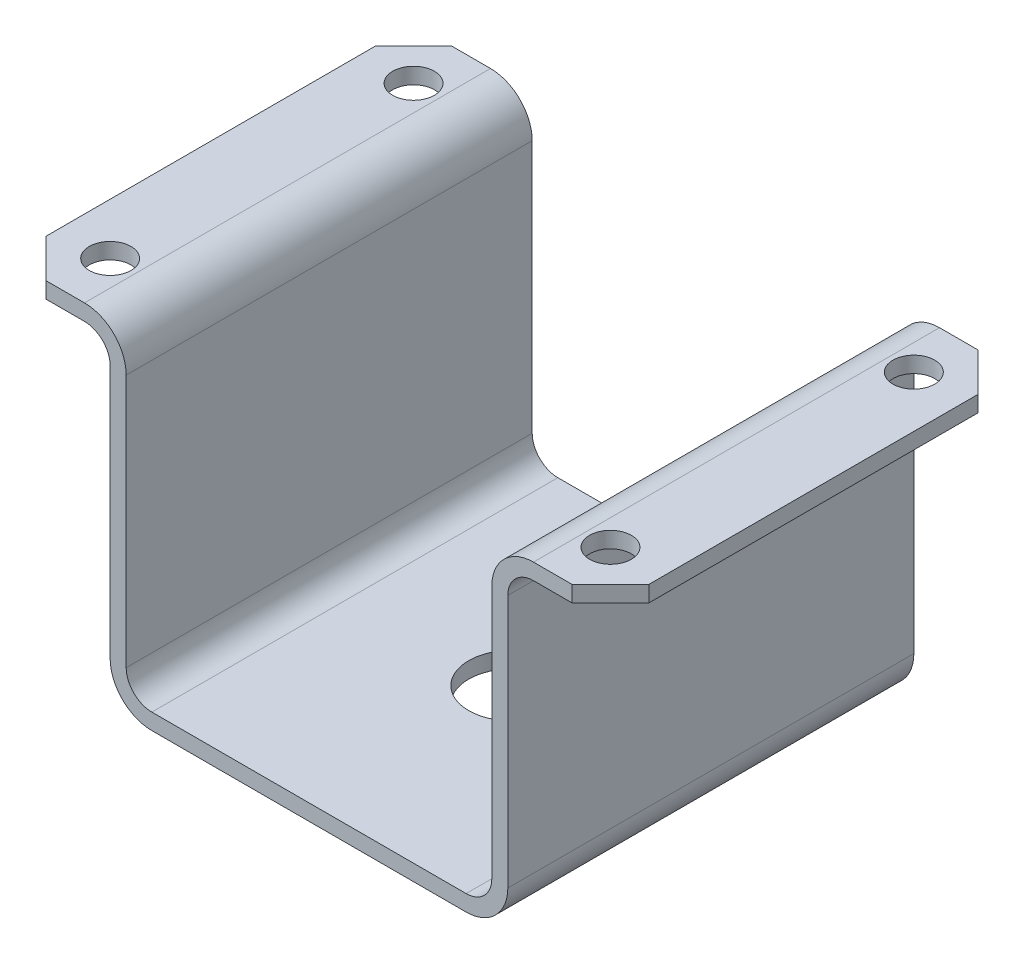
ISO-10303-21;
HEADER;
FILE_DESCRIPTION(('STEP AP214'),'2;1');
FILE_NAME('part.step','',(''),(''),'','','');
FILE_SCHEMA(('AUTOMOTIVE_DESIGN { 1 0 10303 214 1 1 1 1 }'));
ENDSEC;
DATA;
#1=APPLICATION_CONTEXT('core data for automotive mechanical design processes');
#2=APPLICATION_PROTOCOL_DEFINITION('international standard','automotive_design',2000,#1);
#3=PRODUCT_CONTEXT('',#1,'mechanical');
#4=PRODUCT('Part','Part','',(#3));
#5=PRODUCT_RELATED_PRODUCT_CATEGORY('part','',(#4));
#6=PRODUCT_DEFINITION_FORMATION('','',#4);
#7=PRODUCT_DEFINITION_CONTEXT('part definition',#1,'design');
#8=PRODUCT_DEFINITION('design','',#6,#7);
#9=PRODUCT_DEFINITION_SHAPE('','',#8);
#10=(LENGTH_UNIT() NAMED_UNIT(*) SI_UNIT(.MILLI.,.METRE.));
#11=(NAMED_UNIT(*) PLANE_ANGLE_UNIT() SI_UNIT($,.RADIAN.));
#12=(NAMED_UNIT(*) SI_UNIT($,.STERADIAN.) SOLID_ANGLE_UNIT());
#13=UNCERTAINTY_MEASURE_WITH_UNIT(LENGTH_MEASURE(1.E-05),#10,'distance_accuracy_value','');
#14=(GEOMETRIC_REPRESENTATION_CONTEXT(3) GLOBAL_UNCERTAINTY_ASSIGNED_CONTEXT((#13)) GLOBAL_UNIT_ASSIGNED_CONTEXT((#10,
#11,#12)) REPRESENTATION_CONTEXT('',''));
#15=CARTESIAN_POINT('',(0.,0.,0.));
#16=DIRECTION('',(0.,0.,1.));
#17=DIRECTION('',(1.,0.,0.));
#18=AXIS2_PLACEMENT_3D('',#15,#16,#17);
#19=CARTESIAN_POINT('',(-47.,50.,-31.65));
#20=DIRECTION('',(-1.,0.,0.));
#21=DIRECTION('',(0.,0.,1.));
#22=AXIS2_PLACEMENT_3D('',#19,#20,#21);
#23=PLANE('',#22);
#24=DIRECTION('',(0.,1.,0.));
#25=VECTOR('',#24,1.);
#26=CARTESIAN_POINT('',(-47.,36.554648241206,25.65));
#27=LINE('',#26,#25);
#28=CARTESIAN_POINT('',(-47.,52.5,25.65));
#29=VERTEX_POINT('',#28);
#30=CARTESIAN_POINT('',(-47.,50.,25.65));
#31=VERTEX_POINT('',#30);
#32=EDGE_CURVE('E302',#29,#31,#27,.F.);
#33=ORIENTED_EDGE('',*,*,#32,.F.);
#34=DIRECTION('',(0.,0.,1.));
#35=VECTOR('',#34,1.);
#36=CARTESIAN_POINT('',(-47.,52.5,-31.65));
#37=LINE('',#36,#35);
#38=CARTESIAN_POINT('',(-47.,52.5,-25.65));
#39=VERTEX_POINT('',#38);
#40=EDGE_CURVE('E313',#39,#29,#37,.T.);
#41=ORIENTED_EDGE('',*,*,#40,.F.);
#42=DIRECTION('',(0.,1.,0.));
#43=VECTOR('',#42,1.);
#44=CARTESIAN_POINT('',(-47.,36.554648241206,-25.65));
#45=LINE('',#44,#43);
#46=CARTESIAN_POINT('',(-47.,50.,-25.65));
#47=VERTEX_POINT('',#46);
#48=EDGE_CURVE('E167',#47,#39,#45,.T.);
#49=ORIENTED_EDGE('',*,*,#48,.F.);
#50=DIRECTION('',(0.,0.,-1.));
#51=VECTOR('',#50,1.);
#52=CARTESIAN_POINT('',(-47.,50.,-31.65));
#53=LINE('',#52,#51);
#54=EDGE_CURVE('E273',#31,#47,#53,.T.);
#55=ORIENTED_EDGE('',*,*,#54,.F.);
#56=EDGE_LOOP('',(#33,#41,#49,#55));
#57=FACE_BOUND('',#56,.T.);
#58=ADVANCED_FACE('F17',(#57),#23,.T.);
#59=CARTESIAN_POINT('',(-39.,52.5,-23.65));
#60=DIRECTION('',(0.,-1.,0.));
#61=DIRECTION('',(0.,0.,-1.));
#62=AXIS2_PLACEMENT_3D('',#59,#60,#61);
#63=CYLINDRICAL_SURFACE('',#62,3.25000000000001);
#64=CARTESIAN_POINT('',(-39.,50.,-23.65));
#65=DIRECTION('',(0.,-1.,0.));
#66=DIRECTION('',(0.,0.,-1.));
#67=AXIS2_PLACEMENT_3D('',#64,#65,#66);
#68=CIRCLE('',#67,3.25000000000001);
#69=CARTESIAN_POINT('',(-39.,50.,-26.9));
#70=VERTEX_POINT('',#69);
#71=EDGE_CURVE('E270',#70,#70,#68,.F.);
#72=ORIENTED_EDGE('',*,*,#71,.F.);
#73=EDGE_LOOP('',(#72));
#74=FACE_BOUND('',#73,.T.);
#75=CARTESIAN_POINT('',(-39.,52.5,-23.65));
#76=DIRECTION('',(0.,-1.,0.));
#77=DIRECTION('',(0.,0.,-1.));
#78=AXIS2_PLACEMENT_3D('',#75,#76,#77);
#79=CIRCLE('',#78,3.25000000000001);
#80=CARTESIAN_POINT('',(-39.,52.5,-26.9));
#81=VERTEX_POINT('',#80);
#82=EDGE_CURVE('E278',#81,#81,#79,.T.);
#83=ORIENTED_EDGE('',*,*,#82,.F.);
#84=EDGE_LOOP('',(#83));
#85=FACE_BOUND('',#84,.T.);
#86=ADVANCED_FACE('F460',(#74,#85),#63,.F.);
#87=CARTESIAN_POINT('',(-39.,52.5,23.65));
#88=DIRECTION('',(0.,-1.,0.));
#89=DIRECTION('',(0.,0.,-1.));
#90=AXIS2_PLACEMENT_3D('',#87,#88,#89);
#91=CYLINDRICAL_SURFACE('',#90,3.25);
#92=CARTESIAN_POINT('',(-39.,50.,23.65));
#93=DIRECTION('',(0.,-1.,0.));
#94=DIRECTION('',(0.,0.,-1.));
#95=AXIS2_PLACEMENT_3D('',#92,#93,#94);
#96=CIRCLE('',#95,3.25);
#97=CARTESIAN_POINT('',(-39.,50.,20.4));
#98=VERTEX_POINT('',#97);
#99=EDGE_CURVE('E266',#98,#98,#96,.F.);
#100=ORIENTED_EDGE('',*,*,#99,.F.);
#101=EDGE_LOOP('',(#100));
#102=FACE_BOUND('',#101,.T.);
#103=CARTESIAN_POINT('',(-39.,52.5,23.65));
#104=DIRECTION('',(0.,-1.,0.));
#105=DIRECTION('',(0.,0.,-1.));
#106=AXIS2_PLACEMENT_3D('',#103,#104,#105);
#107=CIRCLE('',#106,3.25);
#108=CARTESIAN_POINT('',(-39.,52.5,20.4));
#109=VERTEX_POINT('',#108);
#110=EDGE_CURVE('E274',#109,#109,#107,.T.);
#111=ORIENTED_EDGE('',*,*,#110,.F.);
#112=EDGE_LOOP('',(#111));
#113=FACE_BOUND('',#112,.T.);
#114=ADVANCED_FACE('F466',(#102,#113),#91,.F.);
#115=CARTESIAN_POINT('',(47.,52.5,-25.65));
#116=DIRECTION('',(1.,0.,0.));
#117=DIRECTION('',(0.,0.,1.));
#118=AXIS2_PLACEMENT_3D('',#115,#116,#117);
#119=PLANE('',#118);
#120=DIRECTION('',(0.,1.,0.));
#121=VECTOR('',#120,1.);
#122=CARTESIAN_POINT('',(47.,36.554648241206,25.65));
#123=LINE('',#122,#121);
#124=CARTESIAN_POINT('',(47.,50.,25.65));
#125=VERTEX_POINT('',#124);
#126=CARTESIAN_POINT('',(47.,52.5,25.65));
#127=VERTEX_POINT('',#126);
#128=EDGE_CURVE('E166',#125,#127,#123,.T.);
#129=ORIENTED_EDGE('',*,*,#128,.F.);
#130=DIRECTION('',(0.,0.,1.));
#131=VECTOR('',#130,1.);
#132=CARTESIAN_POINT('',(47.,50.,0.));
#133=LINE('',#132,#131);
#134=CARTESIAN_POINT('',(47.,50.,-25.65));
#135=VERTEX_POINT('',#134);
#136=EDGE_CURVE('E163',#135,#125,#133,.T.);
#137=ORIENTED_EDGE('',*,*,#136,.F.);
#138=DIRECTION('',(0.,1.,0.));
#139=VECTOR('',#138,1.);
#140=CARTESIAN_POINT('',(47.,36.554648241206,-25.65));
#141=LINE('',#140,#139);
#142=CARTESIAN_POINT('',(47.,52.5,-25.65));
#143=VERTEX_POINT('',#142);
#144=EDGE_CURVE('E156',#143,#135,#141,.F.);
#145=ORIENTED_EDGE('',*,*,#144,.F.);
#146=DIRECTION('',(0.,0.,-1.));
#147=VECTOR('',#146,1.);
#148=CARTESIAN_POINT('',(47.,52.5,0.));
#149=LINE('',#148,#147);
#150=EDGE_CURVE('E160',#127,#143,#149,.T.);
#151=ORIENTED_EDGE('',*,*,#150,.F.);
#152=EDGE_LOOP('',(#129,#137,#145,#151));
#153=FACE_BOUND('',#152,.T.);
#154=ADVANCED_FACE('F158',(#153),#119,.T.);
#155=CARTESIAN_POINT('',(39.,51.25,-23.65));
#156=DIRECTION('',(0.,-1.,0.));
#157=DIRECTION('',(1.,0.,0.));
#158=AXIS2_PLACEMENT_3D('',#155,#156,#157);
#159=CYLINDRICAL_SURFACE('',#158,3.25);
#160=CARTESIAN_POINT('',(39.,50.,-23.65));
#161=DIRECTION('',(0.,-1.,0.));
#162=DIRECTION('',(1.,0.,0.));
#163=AXIS2_PLACEMENT_3D('',#160,#161,#162);
#164=CIRCLE('',#163,3.25);
#165=CARTESIAN_POINT('',(42.25,50.,-23.65));
#166=VERTEX_POINT('',#165);
#167=EDGE_CURVE('E256',#166,#166,#164,.F.);
#168=ORIENTED_EDGE('',*,*,#167,.F.);
#169=EDGE_LOOP('',(#168));
#170=FACE_BOUND('',#169,.T.);
#171=CARTESIAN_POINT('',(39.,52.5,-23.65));
#172=DIRECTION('',(0.,-1.,0.));
#173=DIRECTION('',(1.,0.,0.));
#174=AXIS2_PLACEMENT_3D('',#171,#172,#173);
#175=CIRCLE('',#174,3.25);
#176=CARTESIAN_POINT('',(42.25,52.5,-23.65));
#177=VERTEX_POINT('',#176);
#178=EDGE_CURVE('E179',#177,#177,#175,.T.);
#179=ORIENTED_EDGE('',*,*,#178,.F.);
#180=EDGE_LOOP('',(#179));
#181=FACE_BOUND('',#180,.T.);
#182=ADVANCED_FACE('F529',(#170,#181),#159,.F.);
#183=CARTESIAN_POINT('',(39.,51.25,23.65));
#184=DIRECTION('',(0.,-1.,0.));
#185=DIRECTION('',(1.,0.,0.));
#186=AXIS2_PLACEMENT_3D('',#183,#184,#185);
#187=CYLINDRICAL_SURFACE('',#186,3.25);
#188=CARTESIAN_POINT('',(39.,50.,23.65));
#189=DIRECTION('',(0.,-1.,0.));
#190=DIRECTION('',(1.,0.,0.));
#191=AXIS2_PLACEMENT_3D('',#188,#189,#190);
#192=CIRCLE('',#191,3.25);
#193=CARTESIAN_POINT('',(42.25,50.,23.65));
#194=VERTEX_POINT('',#193);
#195=EDGE_CURVE('E252',#194,#194,#192,.F.);
#196=ORIENTED_EDGE('',*,*,#195,.F.);
#197=EDGE_LOOP('',(#196));
#198=FACE_BOUND('',#197,.T.);
#199=CARTESIAN_POINT('',(39.,52.5,23.65));
#200=DIRECTION('',(0.,-1.,0.));
#201=DIRECTION('',(1.,0.,0.));
#202=AXIS2_PLACEMENT_3D('',#199,#200,#201);
#203=CIRCLE('',#202,3.25);
#204=CARTESIAN_POINT('',(42.25,52.5,23.65));
#205=VERTEX_POINT('',#204);
#206=EDGE_CURVE('E182',#205,#205,#203,.T.);
#207=ORIENTED_EDGE('',*,*,#206,.F.);
#208=EDGE_LOOP('',(#207));
#209=FACE_BOUND('',#208,.T.);
#210=ADVANCED_FACE('F527',(#198,#209),#187,.F.);
#211=CARTESIAN_POINT('',(-44.,36.554648241206,-28.65));
#212=DIRECTION('',(-0.707106781186547,0.,-0.707106781186548));
#213=DIRECTION('',(-0.707106781186548,0.,0.707106781186547));
#214=AXIS2_PLACEMENT_3D('',#211,#212,#213);
#215=PLANE('',#214);
#216=DIRECTION('',(0.707106781186548,0.,-0.707106781186547));
#217=VECTOR('',#216,1.);
#218=CARTESIAN_POINT('',(-47.,50.,-25.65));
#219=LINE('',#218,#217);
#220=CARTESIAN_POINT('',(-41.,50.,-31.65));
#221=VERTEX_POINT('',#220);
#222=EDGE_CURVE('E298',#47,#221,#219,.T.);
#223=ORIENTED_EDGE('',*,*,#222,.F.);
#224=ORIENTED_EDGE('',*,*,#48,.T.);
#225=DIRECTION('',(-0.707106781186548,0.,0.707106781186547));
#226=VECTOR('',#225,1.);
#227=CARTESIAN_POINT('',(-41.,52.5,-31.65));
#228=LINE('',#227,#226);
#229=CARTESIAN_POINT('',(-41.,52.5,-31.65));
#230=VERTEX_POINT('',#229);
#231=EDGE_CURVE('E310',#230,#39,#228,.T.);
#232=ORIENTED_EDGE('',*,*,#231,.F.);
#233=DIRECTION('',(0.,1.,0.));
#234=VECTOR('',#233,1.);
#235=CARTESIAN_POINT('',(-41.,23.1092964824121,-31.65));
#236=LINE('',#235,#234);
#237=EDGE_CURVE('E305',#230,#221,#236,.F.);
#238=ORIENTED_EDGE('',*,*,#237,.T.);
#239=EDGE_LOOP('',(#223,#224,#232,#238));
#240=FACE_BOUND('',#239,.T.);
#241=ADVANCED_FACE('F453',(#240),#215,.T.);
#242=CARTESIAN_POINT('',(44.,36.554648241206,-28.65));
#243=DIRECTION('',(0.707106781186547,0.,-0.707106781186548));
#244=DIRECTION('',(-0.707106781186548,0.,-0.707106781186547));
#245=AXIS2_PLACEMENT_3D('',#242,#243,#244);
#246=PLANE('',#245);
#247=DIRECTION('',(0.707106781186548,0.,0.707106781186548));
#248=VECTOR('',#247,1.);
#249=CARTESIAN_POINT('',(41.,50.,-31.65));
#250=LINE('',#249,#248);
#251=CARTESIAN_POINT('',(41.,50.,-31.65));
#252=VERTEX_POINT('',#251);
#253=EDGE_CURVE('E263',#252,#135,#250,.T.);
#254=ORIENTED_EDGE('',*,*,#253,.F.);
#255=DIRECTION('',(0.,1.,0.));
#256=VECTOR('',#255,1.);
#257=CARTESIAN_POINT('',(41.,23.1092964824121,-31.65));
#258=LINE('',#257,#256);
#259=CARTESIAN_POINT('',(41.,52.5,-31.65));
#260=VERTEX_POINT('',#259);
#261=EDGE_CURVE('E173',#252,#260,#258,.T.);
#262=ORIENTED_EDGE('',*,*,#261,.T.);
#263=DIRECTION('',(-0.707106781186548,0.,-0.707106781186548));
#264=VECTOR('',#263,1.);
#265=CARTESIAN_POINT('',(47.,52.5,-25.65));
#266=LINE('',#265,#264);
#267=EDGE_CURVE('E21',#143,#260,#266,.T.);
#268=ORIENTED_EDGE('',*,*,#267,.F.);
#269=ORIENTED_EDGE('',*,*,#144,.T.);
#270=EDGE_LOOP('',(#254,#262,#268,#269));
#271=FACE_BOUND('',#270,.T.);
#272=ADVANCED_FACE('F171',(#271),#246,.T.);
#273=CARTESIAN_POINT('',(44.,36.554648241206,28.65));
#274=DIRECTION('',(0.707106781186548,0.,0.707106781186547));
#275=DIRECTION('',(0.707106781186547,0.,-0.707106781186548));
#276=AXIS2_PLACEMENT_3D('',#273,#274,#275);
#277=PLANE('',#276);
#278=DIRECTION('',(-0.707106781186547,0.,0.707106781186548));
#279=VECTOR('',#278,1.);
#280=CARTESIAN_POINT('',(47.,50.,25.65));
#281=LINE('',#280,#279);
#282=CARTESIAN_POINT('',(41.,50.,31.65));
#283=VERTEX_POINT('',#282);
#284=EDGE_CURVE('E260',#125,#283,#281,.T.);
#285=ORIENTED_EDGE('',*,*,#284,.F.);
#286=ORIENTED_EDGE('',*,*,#128,.T.);
#287=DIRECTION('',(0.707106781186547,0.,-0.707106781186548));
#288=VECTOR('',#287,1.);
#289=CARTESIAN_POINT('',(41.,52.5,31.65));
#290=LINE('',#289,#288);
#291=CARTESIAN_POINT('',(41.,52.5,31.65));
#292=VERTEX_POINT('',#291);
#293=EDGE_CURVE('E176',#292,#127,#290,.T.);
#294=ORIENTED_EDGE('',*,*,#293,.F.);
#295=DIRECTION('',(0.,1.,0.));
#296=VECTOR('',#295,1.);
#297=CARTESIAN_POINT('',(41.,23.1092964824121,31.65));
#298=LINE('',#297,#296);
#299=EDGE_CURVE('E381',#283,#292,#298,.T.);
#300=ORIENTED_EDGE('',*,*,#299,.F.);
#301=EDGE_LOOP('',(#285,#286,#294,#300));
#302=FACE_BOUND('',#301,.T.);
#303=ADVANCED_FACE('F519',(#302),#277,.T.);
#304=CARTESIAN_POINT('',(35.,52.5,-31.65));
#305=DIRECTION('',(0.,1.,0.));
#306=DIRECTION('',(0.,0.,1.));
#307=AXIS2_PLACEMENT_3D('',#304,#305,#306);
#308=PLANE('',#307);
#309=ORIENTED_EDGE('',*,*,#206,.T.);
#310=EDGE_LOOP('',(#309));
#311=FACE_BOUND('',#310,.T.);
#312=ORIENTED_EDGE('',*,*,#178,.T.);
#313=EDGE_LOOP('',(#312));
#314=FACE_BOUND('',#313,.T.);
#315=ORIENTED_EDGE('',*,*,#293,.T.);
#316=ORIENTED_EDGE('',*,*,#150,.T.);
#317=ORIENTED_EDGE('',*,*,#267,.T.);
#318=DIRECTION('',(1.,0.,0.));
#319=VECTOR('',#318,1.);
#320=CARTESIAN_POINT('',(-26.6407035175879,52.5,-31.65));
#321=LINE('',#320,#319);
#322=CARTESIAN_POINT('',(35.,52.5,-31.65));
#323=VERTEX_POINT('',#322);
#324=EDGE_CURVE('E251',#260,#323,#321,.F.);
#325=ORIENTED_EDGE('',*,*,#324,.T.);
#326=DIRECTION('',(0.,0.,-1.));
#327=VECTOR('',#326,1.);
#328=CARTESIAN_POINT('',(35.,52.5,0.));
#329=LINE('',#328,#327);
#330=CARTESIAN_POINT('',(35.,52.5,31.65));
#331=VERTEX_POINT('',#330);
#332=EDGE_CURVE('E283',#331,#323,#329,.T.);
#333=ORIENTED_EDGE('',*,*,#332,.F.);
#334=DIRECTION('',(1.,0.,0.));
#335=VECTOR('',#334,1.);
#336=CARTESIAN_POINT('',(-26.6407035175879,52.5,31.65));
#337=LINE('',#336,#335);
#338=EDGE_CURVE('E226',#292,#331,#337,.F.);
#339=ORIENTED_EDGE('',*,*,#338,.F.);
#340=EDGE_LOOP('',(#315,#316,#317,#325,#333,#339));
#341=FACE_BOUND('',#340,.T.);
#342=ADVANCED_FACE('F177',(#311,#314,#341),#308,.T.);
#343=CARTESIAN_POINT('',(35.,46.,31.65));
#344=DIRECTION('',(0.,0.,-1.));
#345=DIRECTION('',(-1.,0.,0.));
#346=AXIS2_PLACEMENT_3D('',#343,#344,#345);
#347=CYLINDRICAL_SURFACE('',#346,6.5);
#348=ORIENTED_EDGE('',*,*,#332,.T.);
#349=CARTESIAN_POINT('',(35.,46.,-31.65));
#350=DIRECTION('',(0.,0.,-1.));
#351=DIRECTION('',(-1.,0.,0.));
#352=AXIS2_PLACEMENT_3D('',#349,#350,#351);
#353=CIRCLE('',#352,6.5);
#354=CARTESIAN_POINT('',(28.5,46.,-31.65));
#355=VERTEX_POINT('',#354);
#356=EDGE_CURVE('E249',#323,#355,#353,.F.);
#357=ORIENTED_EDGE('',*,*,#356,.T.);
#358=DIRECTION('',(0.,0.,-1.));
#359=VECTOR('',#358,1.);
#360=CARTESIAN_POINT('',(28.5,46.,0.));
#361=LINE('',#360,#359);
#362=CARTESIAN_POINT('',(28.5,46.,31.65));
#363=VERTEX_POINT('',#362);
#364=EDGE_CURVE('E287',#363,#355,#361,.T.);
#365=ORIENTED_EDGE('',*,*,#364,.F.);
#366=CARTESIAN_POINT('',(35.,46.,31.65));
#367=DIRECTION('',(0.,0.,-1.));
#368=DIRECTION('',(-1.,0.,0.));
#369=AXIS2_PLACEMENT_3D('',#366,#367,#368);
#370=CIRCLE('',#369,6.5);
#371=EDGE_CURVE('E223',#331,#363,#370,.F.);
#372=ORIENTED_EDGE('',*,*,#371,.F.);
#373=EDGE_LOOP('',(#348,#357,#365,#372));
#374=FACE_BOUND('',#373,.T.);
#375=ADVANCED_FACE('F542',(#374),#347,.T.);
#376=CARTESIAN_POINT('',(28.5,46.,31.65));
#377=DIRECTION('',(-1.,0.,0.));
#378=DIRECTION('',(0.,0.,-1.));
#379=AXIS2_PLACEMENT_3D('',#376,#377,#378);
#380=PLANE('',#379);
#381=DIRECTION('',(0.,0.,-1.));
#382=VECTOR('',#381,1.);
#383=CARTESIAN_POINT('',(28.5,6.5,0.));
#384=LINE('',#383,#382);
#385=CARTESIAN_POINT('',(28.5,6.5,31.65));
#386=VERTEX_POINT('',#385);
#387=CARTESIAN_POINT('',(28.5,6.50000000000005,-31.65));
#388=VERTEX_POINT('',#387);
#389=EDGE_CURVE('E293',#386,#388,#384,.T.);
#390=ORIENTED_EDGE('',*,*,#389,.F.);
#391=DIRECTION('',(0.,1.,0.));
#392=VECTOR('',#391,1.);
#393=CARTESIAN_POINT('',(28.5,23.1092964824121,31.65));
#394=LINE('',#393,#392);
#395=EDGE_CURVE('E222',#363,#386,#394,.F.);
#396=ORIENTED_EDGE('',*,*,#395,.F.);
#397=ORIENTED_EDGE('',*,*,#364,.T.);
#398=DIRECTION('',(0.,1.,0.));
#399=VECTOR('',#398,1.);
#400=CARTESIAN_POINT('',(28.5,23.1092964824121,-31.65));
#401=LINE('',#400,#399);
#402=EDGE_CURVE('E248',#355,#388,#401,.F.);
#403=ORIENTED_EDGE('',*,*,#402,.T.);
#404=EDGE_LOOP('',(#390,#396,#397,#403));
#405=FACE_BOUND('',#404,.T.);
#406=ADVANCED_FACE('F547',(#405),#380,.T.);
#407=CARTESIAN_POINT('',(24.5,6.5,31.65));
#408=DIRECTION('',(0.,0.,-1.));
#409=DIRECTION('',(-1.,0.,0.));
#410=AXIS2_PLACEMENT_3D('',#407,#408,#409);
#411=CYLINDRICAL_SURFACE('',#410,4.);
#412=ORIENTED_EDGE('',*,*,#389,.T.);
#413=CARTESIAN_POINT('',(24.4999999999999,6.50000000000011,-31.65));
#414=DIRECTION('',(0.,0.,-1.));
#415=DIRECTION('',(-1.,0.,0.));
#416=AXIS2_PLACEMENT_3D('',#413,#414,#415);
#417=CIRCLE('',#416,4.);
#418=CARTESIAN_POINT('',(24.5,2.5,-31.65));
#419=VERTEX_POINT('',#418);
#420=EDGE_CURVE('E246',#388,#419,#417,.T.);
#421=ORIENTED_EDGE('',*,*,#420,.T.);
#422=DIRECTION('',(0.,0.,1.));
#423=VECTOR('',#422,1.);
#424=CARTESIAN_POINT('',(24.5,2.5,-31.65));
#425=LINE('',#424,#423);
#426=CARTESIAN_POINT('',(24.5,2.5,31.65));
#427=VERTEX_POINT('',#426);
#428=EDGE_CURVE('E350',#427,#419,#425,.F.);
#429=ORIENTED_EDGE('',*,*,#428,.F.);
#430=CARTESIAN_POINT('',(24.5,6.5,31.65));
#431=DIRECTION('',(0.,0.,-1.));
#432=DIRECTION('',(-1.,0.,0.));
#433=AXIS2_PLACEMENT_3D('',#430,#431,#432);
#434=CIRCLE('',#433,4.);
#435=EDGE_CURVE('E219',#386,#427,#434,.T.);
#436=ORIENTED_EDGE('',*,*,#435,.F.);
#437=EDGE_LOOP('',(#412,#421,#429,#436));
#438=FACE_BOUND('',#437,.T.);
#439=ADVANCED_FACE('F358',(#438),#411,.F.);
#440=CARTESIAN_POINT('',(-24.5,6.5,0.));
#441=DIRECTION('',(0.,0.,1.));
#442=DIRECTION('',(1.,0.,0.));
#443=AXIS2_PLACEMENT_3D('',#440,#441,#442);
#444=CYLINDRICAL_SURFACE('',#443,4.);
#445=CARTESIAN_POINT('',(-24.5,6.5,-31.65));
#446=DIRECTION('',(0.,0.,1.));
#447=DIRECTION('',(1.,0.,0.));
#448=AXIS2_PLACEMENT_3D('',#445,#446,#447);
#449=CIRCLE('',#448,4.);
#450=CARTESIAN_POINT('',(-24.5,2.5,-31.65));
#451=VERTEX_POINT('',#450);
#452=CARTESIAN_POINT('',(-28.5,6.5,-31.65));
#453=VERTEX_POINT('',#452);
#454=EDGE_CURVE('E243',#451,#453,#449,.F.);
#455=ORIENTED_EDGE('',*,*,#454,.T.);
#456=DIRECTION('',(0.,0.,-1.));
#457=VECTOR('',#456,1.);
#458=CARTESIAN_POINT('',(-28.5,6.5,-31.65));
#459=LINE('',#458,#457);
#460=CARTESIAN_POINT('',(-28.5,6.5,31.65));
#461=VERTEX_POINT('',#460);
#462=EDGE_CURVE('E347',#461,#453,#459,.T.);
#463=ORIENTED_EDGE('',*,*,#462,.F.);
#464=CARTESIAN_POINT('',(-24.5,6.5,31.65));
#465=DIRECTION('',(0.,0.,1.));
#466=DIRECTION('',(1.,0.,0.));
#467=AXIS2_PLACEMENT_3D('',#464,#465,#466);
#468=CIRCLE('',#467,4.);
#469=CARTESIAN_POINT('',(-24.5,2.5,31.65));
#470=VERTEX_POINT('',#469);
#471=EDGE_CURVE('E215',#470,#461,#468,.F.);
#472=ORIENTED_EDGE('',*,*,#471,.F.);
#473=DIRECTION('',(0.,0.,1.));
#474=VECTOR('',#473,1.);
#475=CARTESIAN_POINT('',(-24.5,2.5,-31.65));
#476=LINE('',#475,#474);
#477=EDGE_CURVE('E353',#451,#470,#476,.T.);
#478=ORIENTED_EDGE('',*,*,#477,.F.);
#479=EDGE_LOOP('',(#455,#463,#472,#478));
#480=FACE_BOUND('',#479,.T.);
#481=ADVANCED_FACE('F514',(#480),#444,.F.);
#482=CARTESIAN_POINT('',(-28.5,52.5,-31.65));
#483=DIRECTION('',(1.,0.,0.));
#484=DIRECTION('',(0.,0.,-1.));
#485=AXIS2_PLACEMENT_3D('',#482,#483,#484);
#486=PLANE('',#485);
#487=ORIENTED_EDGE('',*,*,#462,.T.);
#488=DIRECTION('',(0.,1.,0.));
#489=VECTOR('',#488,1.);
#490=CARTESIAN_POINT('',(-28.5,23.1092964824121,-31.65));
#491=LINE('',#490,#489);
#492=CARTESIAN_POINT('',(-28.5,46.,-31.65));
#493=VERTEX_POINT('',#492);
#494=EDGE_CURVE('E242',#453,#493,#491,.T.);
#495=ORIENTED_EDGE('',*,*,#494,.T.);
#496=DIRECTION('',(0.,0.,-1.));
#497=VECTOR('',#496,1.);
#498=CARTESIAN_POINT('',(-28.5,46.,0.));
#499=LINE('',#498,#497);
#500=CARTESIAN_POINT('',(-28.5,46.,31.65));
#501=VERTEX_POINT('',#500);
#502=EDGE_CURVE('E314',#501,#493,#499,.T.);
#503=ORIENTED_EDGE('',*,*,#502,.F.);
#504=DIRECTION('',(0.,1.,0.));
#505=VECTOR('',#504,1.);
#506=CARTESIAN_POINT('',(-28.5,23.1092964824121,31.65));
#507=LINE('',#506,#505);
#508=EDGE_CURVE('E214',#461,#501,#507,.T.);
#509=ORIENTED_EDGE('',*,*,#508,.F.);
#510=EDGE_LOOP('',(#487,#495,#503,#509));
#511=FACE_BOUND('',#510,.T.);
#512=ADVANCED_FACE('F510',(#511),#486,.T.);
#513=CARTESIAN_POINT('',(-35.,46.,0.));
#514=DIRECTION('',(0.,0.,-1.));
#515=DIRECTION('',(-1.,0.,0.));
#516=AXIS2_PLACEMENT_3D('',#513,#514,#515);
#517=CYLINDRICAL_SURFACE('',#516,6.49999999999999);
#518=DIRECTION('',(0.,0.,1.));
#519=VECTOR('',#518,1.);
#520=CARTESIAN_POINT('',(-35.,52.5,-31.65));
#521=LINE('',#520,#519);
#522=CARTESIAN_POINT('',(-35.,52.5,31.65));
#523=VERTEX_POINT('',#522);
#524=CARTESIAN_POINT('',(-35.,52.5,-31.65));
#525=VERTEX_POINT('',#524);
#526=EDGE_CURVE('E281',#523,#525,#521,.F.);
#527=ORIENTED_EDGE('',*,*,#526,.F.);
#528=CARTESIAN_POINT('',(-35.,46.,31.65));
#529=DIRECTION('',(0.,0.,-1.));
#530=DIRECTION('',(-1.,0.,0.));
#531=AXIS2_PLACEMENT_3D('',#528,#529,#530);
#532=CIRCLE('',#531,6.49999999999999);
#533=EDGE_CURVE('E210',#501,#523,#532,.F.);
#534=ORIENTED_EDGE('',*,*,#533,.F.);
#535=ORIENTED_EDGE('',*,*,#502,.T.);
#536=CARTESIAN_POINT('',(-35.,46.,-31.65));
#537=DIRECTION('',(0.,0.,-1.));
#538=DIRECTION('',(-1.,0.,0.));
#539=AXIS2_PLACEMENT_3D('',#536,#537,#538);
#540=CIRCLE('',#539,6.49999999999999);
#541=EDGE_CURVE('E239',#493,#525,#540,.F.);
#542=ORIENTED_EDGE('',*,*,#541,.T.);
#543=EDGE_LOOP('',(#527,#534,#535,#542));
#544=FACE_BOUND('',#543,.T.);
#545=ADVANCED_FACE('F506',(#544),#517,.T.);
#546=CARTESIAN_POINT('',(-47.,52.5,-31.65));
#547=DIRECTION('',(0.,1.,0.));
#548=DIRECTION('',(0.,0.,1.));
#549=AXIS2_PLACEMENT_3D('',#546,#547,#548);
#550=PLANE('',#549);
#551=ORIENTED_EDGE('',*,*,#110,.T.);
#552=EDGE_LOOP('',(#551));
#553=FACE_BOUND('',#552,.T.);
#554=ORIENTED_EDGE('',*,*,#82,.T.);
#555=EDGE_LOOP('',(#554));
#556=FACE_BOUND('',#555,.T.);
#557=ORIENTED_EDGE('',*,*,#526,.T.);
#558=DIRECTION('',(1.,0.,0.));
#559=VECTOR('',#558,1.);
#560=CARTESIAN_POINT('',(-26.6407035175879,52.5,-31.65));
#561=LINE('',#560,#559);
#562=EDGE_CURVE('E241',#525,#230,#561,.F.);
#563=ORIENTED_EDGE('',*,*,#562,.T.);
#564=ORIENTED_EDGE('',*,*,#231,.T.);
#565=ORIENTED_EDGE('',*,*,#40,.T.);
#566=DIRECTION('',(0.707106781186547,0.,0.707106781186548));
#567=VECTOR('',#566,1.);
#568=CARTESIAN_POINT('',(-44.,52.5,28.65));
#569=LINE('',#568,#567);
#570=CARTESIAN_POINT('',(-41.,52.5,31.65));
#571=VERTEX_POINT('',#570);
#572=EDGE_CURVE('E277',#571,#29,#569,.F.);
#573=ORIENTED_EDGE('',*,*,#572,.F.);
#574=DIRECTION('',(1.,0.,0.));
#575=VECTOR('',#574,1.);
#576=CARTESIAN_POINT('',(-26.6407035175879,52.5,31.65));
#577=LINE('',#576,#575);
#578=EDGE_CURVE('E213',#523,#571,#577,.F.);
#579=ORIENTED_EDGE('',*,*,#578,.F.);
#580=EDGE_LOOP('',(#557,#563,#564,#565,#573,#579));
#581=FACE_BOUND('',#580,.T.);
#582=ADVANCED_FACE('F407',(#553,#556,#581),#550,.T.);
#583=CARTESIAN_POINT('',(-44.,36.554648241206,28.65));
#584=DIRECTION('',(-0.707106781186548,0.,0.707106781186547));
#585=DIRECTION('',(0.707106781186547,0.,0.707106781186548));
#586=AXIS2_PLACEMENT_3D('',#583,#584,#585);
#587=PLANE('',#586);
#588=DIRECTION('',(-0.707106781186548,0.,-0.707106781186547));
#589=VECTOR('',#588,1.);
#590=CARTESIAN_POINT('',(-41.,50.,31.65));
#591=LINE('',#590,#589);
#592=CARTESIAN_POINT('',(-41.,50.,31.65));
#593=VERTEX_POINT('',#592);
#594=EDGE_CURVE('E301',#593,#31,#591,.T.);
#595=ORIENTED_EDGE('',*,*,#594,.F.);
#596=DIRECTION('',(0.,1.,0.));
#597=VECTOR('',#596,1.);
#598=CARTESIAN_POINT('',(-41.,23.1092964824121,31.65));
#599=LINE('',#598,#597);
#600=EDGE_CURVE('E394',#571,#593,#599,.F.);
#601=ORIENTED_EDGE('',*,*,#600,.F.);
#602=ORIENTED_EDGE('',*,*,#572,.T.);
#603=ORIENTED_EDGE('',*,*,#32,.T.);
#604=EDGE_LOOP('',(#595,#601,#602,#603));
#605=FACE_BOUND('',#604,.T.);
#606=ADVANCED_FACE('F402',(#605),#587,.T.);
#607=CARTESIAN_POINT('',(-31.,50.,-31.65));
#608=DIRECTION('',(0.,-1.,0.));
#609=DIRECTION('',(0.,0.,-1.));
#610=AXIS2_PLACEMENT_3D('',#607,#608,#609);
#611=PLANE('',#610);
#612=ORIENTED_EDGE('',*,*,#99,.T.);
#613=EDGE_LOOP('',(#612));
#614=FACE_BOUND('',#613,.T.);
#615=ORIENTED_EDGE('',*,*,#71,.T.);
#616=EDGE_LOOP('',(#615));
#617=FACE_BOUND('',#616,.T.);
#618=ORIENTED_EDGE('',*,*,#594,.T.);
#619=ORIENTED_EDGE('',*,*,#54,.T.);
#620=ORIENTED_EDGE('',*,*,#222,.T.);
#621=DIRECTION('',(1.,0.,0.));
#622=VECTOR('',#621,1.);
#623=CARTESIAN_POINT('',(-26.6407035175879,50.,-31.65));
#624=LINE('',#623,#622);
#625=CARTESIAN_POINT('',(-35.,50.,-31.65));
#626=VERTEX_POINT('',#625);
#627=EDGE_CURVE('E238',#221,#626,#624,.T.);
#628=ORIENTED_EDGE('',*,*,#627,.T.);
#629=DIRECTION('',(0.,0.,-1.));
#630=VECTOR('',#629,1.);
#631=CARTESIAN_POINT('',(-35.,50.,0.));
#632=LINE('',#631,#630);
#633=CARTESIAN_POINT('',(-35.,50.,31.65));
#634=VERTEX_POINT('',#633);
#635=EDGE_CURVE('E269',#626,#634,#632,.F.);
#636=ORIENTED_EDGE('',*,*,#635,.T.);
#637=DIRECTION('',(1.,0.,0.));
#638=VECTOR('',#637,1.);
#639=CARTESIAN_POINT('',(-26.6407035175879,50.,31.65));
#640=LINE('',#639,#638);
#641=EDGE_CURVE('E209',#593,#634,#640,.T.);
#642=ORIENTED_EDGE('',*,*,#641,.F.);
#643=EDGE_LOOP('',(#618,#619,#620,#628,#636,#642));
#644=FACE_BOUND('',#643,.T.);
#645=ADVANCED_FACE('F455',(#614,#617,#644),#611,.T.);
#646=CARTESIAN_POINT('',(-35.,46.,0.));
#647=DIRECTION('',(0.,0.,-1.));
#648=DIRECTION('',(-1.,0.,0.));
#649=AXIS2_PLACEMENT_3D('',#646,#647,#648);
#650=CYLINDRICAL_SURFACE('',#649,3.99999999999999);
#651=CARTESIAN_POINT('',(-35.,46.,31.65));
#652=DIRECTION('',(0.,0.,-1.));
#653=DIRECTION('',(-1.,0.,0.));
#654=AXIS2_PLACEMENT_3D('',#651,#652,#653);
#655=CIRCLE('',#654,3.99999999999999);
#656=CARTESIAN_POINT('',(-31.,46.,31.65));
#657=VERTEX_POINT('',#656);
#658=EDGE_CURVE('E206',#634,#657,#655,.T.);
#659=ORIENTED_EDGE('',*,*,#658,.F.);
#660=ORIENTED_EDGE('',*,*,#635,.F.);
#661=CARTESIAN_POINT('',(-35.,46.,-31.65));
#662=DIRECTION('',(0.,0.,-1.));
#663=DIRECTION('',(-1.,0.,0.));
#664=AXIS2_PLACEMENT_3D('',#661,#662,#663);
#665=CIRCLE('',#664,3.99999999999999);
#666=CARTESIAN_POINT('',(-31.,46.,-31.65));
#667=VERTEX_POINT('',#666);
#668=EDGE_CURVE('E235',#626,#667,#665,.T.);
#669=ORIENTED_EDGE('',*,*,#668,.T.);
#670=DIRECTION('',(0.,0.,1.));
#671=VECTOR('',#670,1.);
#672=CARTESIAN_POINT('',(-31.,46.,-31.65));
#673=LINE('',#672,#671);
#674=EDGE_CURVE('E255',#657,#667,#673,.F.);
#675=ORIENTED_EDGE('',*,*,#674,.F.);
#676=EDGE_LOOP('',(#659,#660,#669,#675));
#677=FACE_BOUND('',#676,.T.);
#678=ADVANCED_FACE('F494',(#677),#650,.F.);
#679=CARTESIAN_POINT('',(31.,46.,-31.65));
#680=DIRECTION('',(1.,0.,0.));
#681=DIRECTION('',(0.,0.,1.));
#682=AXIS2_PLACEMENT_3D('',#679,#680,#681);
#683=PLANE('',#682);
#684=DIRECTION('',(0.,0.,1.));
#685=VECTOR('',#684,1.);
#686=CARTESIAN_POINT('',(31.,6.5,0.));
#687=LINE('',#686,#685);
#688=CARTESIAN_POINT('',(31.,6.5,-31.65));
#689=VERTEX_POINT('',#688);
#690=CARTESIAN_POINT('',(31.,6.5,31.65));
#691=VERTEX_POINT('',#690);
#692=EDGE_CURVE('E230',#689,#691,#687,.T.);
#693=ORIENTED_EDGE('',*,*,#692,.F.);
#694=DIRECTION('',(0.,1.,0.));
#695=VECTOR('',#694,1.);
#696=CARTESIAN_POINT('',(31.,23.1092964824121,-31.65));
#697=LINE('',#696,#695);
#698=CARTESIAN_POINT('',(31.,46.,-31.65));
#699=VERTEX_POINT('',#698);
#700=EDGE_CURVE('E234',#689,#699,#697,.T.);
#701=ORIENTED_EDGE('',*,*,#700,.T.);
#702=DIRECTION('',(0.,0.,-1.));
#703=VECTOR('',#702,1.);
#704=CARTESIAN_POINT('',(31.,46.,0.));
#705=LINE('',#704,#703);
#706=CARTESIAN_POINT('',(31.,46.,31.65));
#707=VERTEX_POINT('',#706);
#708=EDGE_CURVE('E265',#707,#699,#705,.T.);
#709=ORIENTED_EDGE('',*,*,#708,.F.);
#710=DIRECTION('',(0.,1.,0.));
#711=VECTOR('',#710,1.);
#712=CARTESIAN_POINT('',(31.,23.1092964824121,31.65));
#713=LINE('',#712,#711);
#714=EDGE_CURVE('E201',#691,#707,#713,.T.);
#715=ORIENTED_EDGE('',*,*,#714,.F.);
#716=EDGE_LOOP('',(#693,#701,#709,#715));
#717=FACE_BOUND('',#716,.T.);
#718=ADVANCED_FACE('F497',(#717),#683,.T.);
#719=CARTESIAN_POINT('',(35.,46.,-31.65));
#720=DIRECTION('',(0.,0.,1.));
#721=DIRECTION('',(1.,0.,0.));
#722=AXIS2_PLACEMENT_3D('',#719,#720,#721);
#723=CYLINDRICAL_SURFACE('',#722,3.99999999999999);
#724=DIRECTION('',(0.,0.,-1.));
#725=VECTOR('',#724,1.);
#726=CARTESIAN_POINT('',(35.,50.,0.));
#727=LINE('',#726,#725);
#728=CARTESIAN_POINT('',(35.,50.,31.65));
#729=VERTEX_POINT('',#728);
#730=CARTESIAN_POINT('',(35.,50.,-31.65));
#731=VERTEX_POINT('',#730);
#732=EDGE_CURVE('E259',#729,#731,#727,.T.);
#733=ORIENTED_EDGE('',*,*,#732,.F.);
#734=CARTESIAN_POINT('',(35.,46.,31.65));
#735=DIRECTION('',(0.,0.,1.));
#736=DIRECTION('',(1.,0.,0.));
#737=AXIS2_PLACEMENT_3D('',#734,#735,#736);
#738=CIRCLE('',#737,3.99999999999999);
#739=EDGE_CURVE('E198',#707,#729,#738,.F.);
#740=ORIENTED_EDGE('',*,*,#739,.F.);
#741=ORIENTED_EDGE('',*,*,#708,.T.);
#742=CARTESIAN_POINT('',(35.,46.,-31.65));
#743=DIRECTION('',(0.,0.,1.));
#744=DIRECTION('',(1.,0.,0.));
#745=AXIS2_PLACEMENT_3D('',#742,#743,#744);
#746=CIRCLE('',#745,3.99999999999999);
#747=EDGE_CURVE('E231',#699,#731,#746,.F.);
#748=ORIENTED_EDGE('',*,*,#747,.T.);
#749=EDGE_LOOP('',(#733,#740,#741,#748));
#750=FACE_BOUND('',#749,.T.);
#751=ADVANCED_FACE('F557',(#750),#723,.F.);
#752=CARTESIAN_POINT('',(35.,50.,31.65));
#753=DIRECTION('',(0.,-1.,0.));
#754=DIRECTION('',(0.,0.,-1.));
#755=AXIS2_PLACEMENT_3D('',#752,#753,#754);
#756=PLANE('',#755);
#757=ORIENTED_EDGE('',*,*,#195,.T.);
#758=EDGE_LOOP('',(#757));
#759=FACE_BOUND('',#758,.T.);
#760=ORIENTED_EDGE('',*,*,#167,.T.);
#761=EDGE_LOOP('',(#760));
#762=FACE_BOUND('',#761,.T.);
#763=ORIENTED_EDGE('',*,*,#732,.T.);
#764=DIRECTION('',(1.,0.,0.));
#765=VECTOR('',#764,1.);
#766=CARTESIAN_POINT('',(-26.6407035175879,50.,-31.65));
#767=LINE('',#766,#765);
#768=EDGE_CURVE('E233',#731,#252,#767,.T.);
#769=ORIENTED_EDGE('',*,*,#768,.T.);
#770=ORIENTED_EDGE('',*,*,#253,.T.);
#771=ORIENTED_EDGE('',*,*,#136,.T.);
#772=ORIENTED_EDGE('',*,*,#284,.T.);
#773=DIRECTION('',(1.,0.,0.));
#774=VECTOR('',#773,1.);
#775=CARTESIAN_POINT('',(-26.6407035175879,50.,31.65));
#776=LINE('',#775,#774);
#777=EDGE_CURVE('E197',#729,#283,#776,.T.);
#778=ORIENTED_EDGE('',*,*,#777,.F.);
#779=EDGE_LOOP('',(#763,#769,#770,#771,#772,#778));
#780=FACE_BOUND('',#779,.T.);
#781=ADVANCED_FACE('F493',(#759,#762,#780),#756,.T.);
#782=CARTESIAN_POINT('',(-31.,0.,-31.65));
#783=DIRECTION('',(-1.,0.,0.));
#784=DIRECTION('',(0.,0.,1.));
#785=AXIS2_PLACEMENT_3D('',#782,#783,#784);
#786=PLANE('',#785);
#787=DIRECTION('',(0.,0.,1.));
#788=VECTOR('',#787,1.);
#789=CARTESIAN_POINT('',(-31.,6.5,0.));
#790=LINE('',#789,#788);
#791=CARTESIAN_POINT('',(-31.,6.5,31.65));
#792=VERTEX_POINT('',#791);
#793=CARTESIAN_POINT('',(-31.,6.5,-31.65));
#794=VERTEX_POINT('',#793);
#795=EDGE_CURVE('E195',#792,#794,#790,.F.);
#796=ORIENTED_EDGE('',*,*,#795,.F.);
#797=DIRECTION('',(0.,1.,0.));
#798=VECTOR('',#797,1.);
#799=CARTESIAN_POINT('',(-31.,23.1092964824121,31.65));
#800=LINE('',#799,#798);
#801=EDGE_CURVE('E205',#657,#792,#800,.F.);
#802=ORIENTED_EDGE('',*,*,#801,.F.);
#803=ORIENTED_EDGE('',*,*,#674,.T.);
#804=DIRECTION('',(0.,1.,0.));
#805=VECTOR('',#804,1.);
#806=CARTESIAN_POINT('',(-31.,23.1092964824121,-31.65));
#807=LINE('',#806,#805);
#808=EDGE_CURVE('E237',#667,#794,#807,.F.);
#809=ORIENTED_EDGE('',*,*,#808,.T.);
#810=EDGE_LOOP('',(#796,#802,#803,#809));
#811=FACE_BOUND('',#810,.T.);
#812=ADVANCED_FACE('F489',(#811),#786,.T.);
#813=CARTESIAN_POINT('',(-28.5,2.5,-31.65));
#814=DIRECTION('',(0.,1.,0.));
#815=DIRECTION('',(0.,0.,1.));
#816=AXIS2_PLACEMENT_3D('',#813,#814,#815);
#817=PLANE('',#816);
#818=CARTESIAN_POINT('',(0.,2.5,0.));
#819=DIRECTION('',(0.,-1.,0.));
#820=DIRECTION('',(1.,0.,0.));
#821=AXIS2_PLACEMENT_3D('',#818,#819,#820);
#822=CIRCLE('',#821,6.75);
#823=CARTESIAN_POINT('',(6.75,2.5,0.));
#824=VERTEX_POINT('',#823);
#825=EDGE_CURVE('E188',#824,#824,#822,.T.);
#826=ORIENTED_EDGE('',*,*,#825,.T.);
#827=EDGE_LOOP('',(#826));
#828=FACE_BOUND('',#827,.T.);
#829=DIRECTION('',(1.,0.,0.));
#830=VECTOR('',#829,1.);
#831=CARTESIAN_POINT('',(-26.6407035175879,2.5,31.65));
#832=LINE('',#831,#830);
#833=EDGE_CURVE('E218',#427,#470,#832,.F.);
#834=ORIENTED_EDGE('',*,*,#833,.F.);
#835=ORIENTED_EDGE('',*,*,#428,.T.);
#836=DIRECTION('',(1.,0.,0.));
#837=VECTOR('',#836,1.);
#838=CARTESIAN_POINT('',(-26.6407035175879,2.5,-31.65));
#839=LINE('',#838,#837);
#840=EDGE_CURVE('E245',#419,#451,#839,.F.);
#841=ORIENTED_EDGE('',*,*,#840,.T.);
#842=ORIENTED_EDGE('',*,*,#477,.T.);
#843=EDGE_LOOP('',(#834,#835,#841,#842));
#844=FACE_BOUND('',#843,.T.);
#845=ADVANCED_FACE('F486',(#828,#844),#817,.T.);
#846=CARTESIAN_POINT('',(-26.6407035175879,23.1092964824121,-31.65));
#847=DIRECTION('',(0.,0.,1.));
#848=DIRECTION('',(1.,0.,0.));
#849=AXIS2_PLACEMENT_3D('',#846,#847,#848);
#850=PLANE('',#849);
#851=ORIENTED_EDGE('',*,*,#768,.F.);
#852=ORIENTED_EDGE('',*,*,#747,.F.);
#853=ORIENTED_EDGE('',*,*,#700,.F.);
#854=CARTESIAN_POINT('',(24.5,6.5,-31.65));
#855=DIRECTION('',(0.,0.,1.));
#856=DIRECTION('',(1.,0.,0.));
#857=AXIS2_PLACEMENT_3D('',#854,#855,#856);
#858=CIRCLE('',#857,6.5);
#859=CARTESIAN_POINT('',(24.5,0.,-31.65));
#860=VERTEX_POINT('',#859);
#861=EDGE_CURVE('E227',#860,#689,#858,.T.);
#862=ORIENTED_EDGE('',*,*,#861,.F.);
#863=DIRECTION('',(1.,0.,0.));
#864=VECTOR('',#863,1.);
#865=CARTESIAN_POINT('',(0.,0.,-31.65));
#866=LINE('',#865,#864);
#867=CARTESIAN_POINT('',(-24.5,0.,-31.65));
#868=VERTEX_POINT('',#867);
#869=EDGE_CURVE('E191',#868,#860,#866,.T.);
#870=ORIENTED_EDGE('',*,*,#869,.F.);
#871=CARTESIAN_POINT('',(-24.5,6.5,-31.65));
#872=DIRECTION('',(0.,0.,1.));
#873=DIRECTION('',(1.,0.,0.));
#874=AXIS2_PLACEMENT_3D('',#871,#872,#873);
#875=CIRCLE('',#874,6.5);
#876=EDGE_CURVE('E192',#794,#868,#875,.T.);
#877=ORIENTED_EDGE('',*,*,#876,.F.);
#878=ORIENTED_EDGE('',*,*,#808,.F.);
#879=ORIENTED_EDGE('',*,*,#668,.F.);
#880=ORIENTED_EDGE('',*,*,#627,.F.);
#881=ORIENTED_EDGE('',*,*,#237,.F.);
#882=ORIENTED_EDGE('',*,*,#562,.F.);
#883=ORIENTED_EDGE('',*,*,#541,.F.);
#884=ORIENTED_EDGE('',*,*,#494,.F.);
#885=ORIENTED_EDGE('',*,*,#454,.F.);
#886=ORIENTED_EDGE('',*,*,#840,.F.);
#887=ORIENTED_EDGE('',*,*,#420,.F.);
#888=ORIENTED_EDGE('',*,*,#402,.F.);
#889=ORIENTED_EDGE('',*,*,#356,.F.);
#890=ORIENTED_EDGE('',*,*,#324,.F.);
#891=ORIENTED_EDGE('',*,*,#261,.F.);
#892=EDGE_LOOP('',(#851,#852,#853,#862,#870,#877,#878,#879,#880,#881,#882,#883,#884,#885,#886,
#887,#888,#889,#890,#891));
#893=FACE_BOUND('',#892,.T.);
#894=ADVANCED_FACE('F366',(#893),#850,.F.);
#895=CARTESIAN_POINT('',(24.5,6.5,-31.65));
#896=DIRECTION('',(0.,0.,1.));
#897=DIRECTION('',(1.,0.,0.));
#898=AXIS2_PLACEMENT_3D('',#895,#896,#897);
#899=CYLINDRICAL_SURFACE('',#898,6.5);
#900=ORIENTED_EDGE('',*,*,#692,.T.);
#901=CARTESIAN_POINT('',(24.5,6.5,31.65));
#902=DIRECTION('',(0.,0.,1.));
#903=DIRECTION('',(1.,0.,0.));
#904=AXIS2_PLACEMENT_3D('',#901,#902,#903);
#905=CIRCLE('',#904,6.5);
#906=CARTESIAN_POINT('',(24.5,0.,31.65));
#907=VERTEX_POINT('',#906);
#908=EDGE_CURVE('E202',#907,#691,#905,.T.);
#909=ORIENTED_EDGE('',*,*,#908,.F.);
#910=DIRECTION('',(0.,0.,-1.));
#911=VECTOR('',#910,1.);
#912=CARTESIAN_POINT('',(24.5,0.,-31.65));
#913=LINE('',#912,#911);
#914=EDGE_CURVE('E428',#860,#907,#913,.F.);
#915=ORIENTED_EDGE('',*,*,#914,.F.);
#916=ORIENTED_EDGE('',*,*,#861,.T.);
#917=EDGE_LOOP('',(#900,#909,#915,#916));
#918=FACE_BOUND('',#917,.T.);
#919=ADVANCED_FACE('F483',(#918),#899,.T.);
#920=CARTESIAN_POINT('',(-26.6407035175879,23.1092964824121,31.65));
#921=DIRECTION('',(0.,0.,1.));
#922=DIRECTION('',(1.,0.,0.));
#923=AXIS2_PLACEMENT_3D('',#920,#921,#922);
#924=PLANE('',#923);
#925=ORIENTED_EDGE('',*,*,#739,.T.);
#926=ORIENTED_EDGE('',*,*,#777,.T.);
#927=ORIENTED_EDGE('',*,*,#299,.T.);
#928=ORIENTED_EDGE('',*,*,#338,.T.);
#929=ORIENTED_EDGE('',*,*,#371,.T.);
#930=ORIENTED_EDGE('',*,*,#395,.T.);
#931=ORIENTED_EDGE('',*,*,#435,.T.);
#932=ORIENTED_EDGE('',*,*,#833,.T.);
#933=ORIENTED_EDGE('',*,*,#471,.T.);
#934=ORIENTED_EDGE('',*,*,#508,.T.);
#935=ORIENTED_EDGE('',*,*,#533,.T.);
#936=ORIENTED_EDGE('',*,*,#578,.T.);
#937=ORIENTED_EDGE('',*,*,#600,.T.);
#938=ORIENTED_EDGE('',*,*,#641,.T.);
#939=ORIENTED_EDGE('',*,*,#658,.T.);
#940=ORIENTED_EDGE('',*,*,#801,.T.);
#941=CARTESIAN_POINT('',(-24.5,6.5,31.65));
#942=DIRECTION('',(0.,0.,1.));
#943=DIRECTION('',(1.,0.,0.));
#944=AXIS2_PLACEMENT_3D('',#941,#942,#943);
#945=CIRCLE('',#944,6.5);
#946=CARTESIAN_POINT('',(-24.5,0.,31.65));
#947=VERTEX_POINT('',#946);
#948=EDGE_CURVE('E36',#947,#792,#945,.F.);
#949=ORIENTED_EDGE('',*,*,#948,.F.);
#950=DIRECTION('',(1.,0.,0.));
#951=VECTOR('',#950,1.);
#952=CARTESIAN_POINT('',(0.,0.,31.65));
#953=LINE('',#952,#951);
#954=EDGE_CURVE('E434',#907,#947,#953,.F.);
#955=ORIENTED_EDGE('',*,*,#954,.F.);
#956=ORIENTED_EDGE('',*,*,#908,.T.);
#957=ORIENTED_EDGE('',*,*,#714,.T.);
#958=EDGE_LOOP('',(#925,#926,#927,#928,#929,#930,#931,#932,#933,#934,#935,#936,#937,#938,#939,
#940,#949,#955,#956,#957));
#959=FACE_BOUND('',#958,.T.);
#960=ADVANCED_FACE('F480',(#959),#924,.T.);
#961=CARTESIAN_POINT('',(-24.5,6.5,0.));
#962=DIRECTION('',(0.,0.,1.));
#963=DIRECTION('',(1.,0.,0.));
#964=AXIS2_PLACEMENT_3D('',#961,#962,#963);
#965=CYLINDRICAL_SURFACE('',#964,6.5);
#966=ORIENTED_EDGE('',*,*,#795,.T.);
#967=ORIENTED_EDGE('',*,*,#876,.T.);
#968=DIRECTION('',(0.,0.,-1.));
#969=VECTOR('',#968,1.);
#970=CARTESIAN_POINT('',(-24.5,0.,-31.65));
#971=LINE('',#970,#969);
#972=EDGE_CURVE('E27',#947,#868,#971,.T.);
#973=ORIENTED_EDGE('',*,*,#972,.F.);
#974=ORIENTED_EDGE('',*,*,#948,.T.);
#975=EDGE_LOOP('',(#966,#967,#973,#974));
#976=FACE_BOUND('',#975,.T.);
#977=ADVANCED_FACE('F431',(#976),#965,.T.);
#978=CARTESIAN_POINT('',(0.,2.5,0.));
#979=DIRECTION('',(0.,-1.,0.));
#980=DIRECTION('',(1.,0.,0.));
#981=AXIS2_PLACEMENT_3D('',#978,#979,#980);
#982=CYLINDRICAL_SURFACE('',#981,6.75);
#983=CARTESIAN_POINT('',(0.,0.,0.));
#984=DIRECTION('',(0.,-1.,0.));
#985=DIRECTION('',(1.,0.,0.));
#986=AXIS2_PLACEMENT_3D('',#983,#984,#985);
#987=CIRCLE('',#986,6.75);
#988=CARTESIAN_POINT('',(6.75,0.,0.));
#989=VERTEX_POINT('',#988);
#990=EDGE_CURVE('E11',#989,#989,#987,.F.);
#991=ORIENTED_EDGE('',*,*,#990,.F.);
#992=EDGE_LOOP('',(#991));
#993=FACE_BOUND('',#992,.T.);
#994=ORIENTED_EDGE('',*,*,#825,.F.);
#995=EDGE_LOOP('',(#994));
#996=FACE_BOUND('',#995,.T.);
#997=ADVANCED_FACE('F19',(#993,#996),#982,.F.);
#998=CARTESIAN_POINT('',(0.,0.,-31.65));
#999=DIRECTION('',(0.,-1.,0.));
#1000=DIRECTION('',(0.,0.,-1.));
#1001=AXIS2_PLACEMENT_3D('',#998,#999,#1000);
#1002=PLANE('',#1001);
#1003=ORIENTED_EDGE('',*,*,#990,.T.);
#1004=EDGE_LOOP('',(#1003));
#1005=FACE_BOUND('',#1004,.T.);
#1006=ORIENTED_EDGE('',*,*,#954,.T.);
#1007=ORIENTED_EDGE('',*,*,#972,.T.);
#1008=ORIENTED_EDGE('',*,*,#869,.T.);
#1009=ORIENTED_EDGE('',*,*,#914,.T.);
#1010=EDGE_LOOP('',(#1006,#1007,#1008,#1009));
#1011=FACE_BOUND('',#1010,.T.);
#1012=ADVANCED_FACE('F433',(#1005,#1011),#1002,.T.);
#1013=CLOSED_SHELL('',(#58,#86,#114,#154,#182,#210,#241,#272,#303,#342,#375,#406,#439,#481,#512,
#545,#582,#606,#645,#678,#718,#751,#781,#812,#845,#894,#919,#960,#977,#997,#1012));
#1014=MANIFOLD_SOLID_BREP('B1',#1013);
#1015=ADVANCED_BREP_SHAPE_REPRESENTATION('',(#18,#1014),#14);
#1016=SHAPE_DEFINITION_REPRESENTATION(#9,#1015);
ENDSEC;
END-ISO-10303-21;
